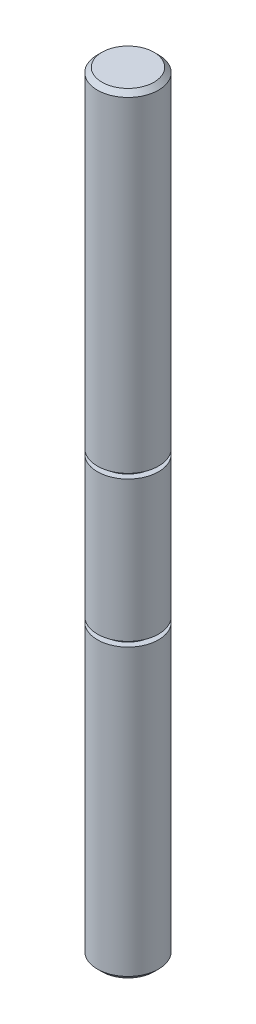
ISO-10303-21;
HEADER;
FILE_DESCRIPTION(('STEP AP214'),'2;1');
FILE_NAME('part.step','',(''),(''),'','','');
FILE_SCHEMA(('AUTOMOTIVE_DESIGN { 1 0 10303 214 1 1 1 1 }'));
ENDSEC;
DATA;
#1=APPLICATION_CONTEXT('core data for automotive mechanical design processes');
#2=APPLICATION_PROTOCOL_DEFINITION('international standard','automotive_design',2000,#1);
#3=PRODUCT_CONTEXT('',#1,'mechanical');
#4=PRODUCT('Part','Part','',(#3));
#5=PRODUCT_RELATED_PRODUCT_CATEGORY('part','',(#4));
#6=PRODUCT_DEFINITION_FORMATION('','',#4);
#7=PRODUCT_DEFINITION_CONTEXT('part definition',#1,'design');
#8=PRODUCT_DEFINITION('design','',#6,#7);
#9=PRODUCT_DEFINITION_SHAPE('','',#8);
#10=(LENGTH_UNIT() NAMED_UNIT(*) SI_UNIT(.MILLI.,.METRE.));
#11=(NAMED_UNIT(*) PLANE_ANGLE_UNIT() SI_UNIT($,.RADIAN.));
#12=(NAMED_UNIT(*) SI_UNIT($,.STERADIAN.) SOLID_ANGLE_UNIT());
#13=UNCERTAINTY_MEASURE_WITH_UNIT(LENGTH_MEASURE(1.E-05),#10,'distance_accuracy_value','');
#14=(GEOMETRIC_REPRESENTATION_CONTEXT(3) GLOBAL_UNCERTAINTY_ASSIGNED_CONTEXT((#13)) GLOBAL_UNIT_ASSIGNED_CONTEXT((#10,
#11,#12)) REPRESENTATION_CONTEXT('',''));
#15=CARTESIAN_POINT('',(0.,0.,0.));
#16=DIRECTION('',(0.,0.,1.));
#17=DIRECTION('',(1.,0.,0.));
#18=AXIS2_PLACEMENT_3D('',#15,#16,#17);
#19=CARTESIAN_POINT('',(0.,126.,0.));
#20=DIRECTION('',(0.,-1.,0.));
#21=DIRECTION('',(0.,0.,-1.));
#22=AXIS2_PLACEMENT_3D('',#19,#20,#21);
#23=CYLINDRICAL_SURFACE('',#22,5.);
#24=CARTESIAN_POINT('',(0.,47.4,0.));
#25=DIRECTION('',(0.,1.,0.));
#26=DIRECTION('',(0.,0.,1.));
#27=AXIS2_PLACEMENT_3D('',#24,#25,#26);
#28=CIRCLE('',#27,5.);
#29=CARTESIAN_POINT('',(0.,47.4,5.));
#30=VERTEX_POINT('',#29);
#31=EDGE_CURVE('E66',#30,#30,#28,.T.);
#32=ORIENTED_EDGE('',*,*,#31,.F.);
#33=EDGE_LOOP('',(#32));
#34=FACE_BOUND('',#33,.T.);
#35=CARTESIAN_POINT('',(0.,0.750000000000001,0.));
#36=DIRECTION('',(0.,1.,0.));
#37=DIRECTION('',(0.,0.,1.));
#38=AXIS2_PLACEMENT_3D('',#35,#36,#37);
#39=CIRCLE('',#38,5.);
#40=CARTESIAN_POINT('',(0.,0.750000000000001,5.));
#41=VERTEX_POINT('',#40);
#42=EDGE_CURVE('E50',#41,#41,#39,.T.);
#43=ORIENTED_EDGE('',*,*,#42,.T.);
#44=EDGE_LOOP('',(#43));
#45=FACE_BOUND('',#44,.T.);
#46=ADVANCED_FACE('F37',(#34,#45),#23,.T.);
#47=CARTESIAN_POINT('',(0.,0.,0.));
#48=DIRECTION('',(0.,1.,0.));
#49=DIRECTION('',(0.,0.,1.));
#50=AXIS2_PLACEMENT_3D('',#47,#48,#49);
#51=PLANE('',#50);
#52=CARTESIAN_POINT('',(0.,0.,0.));
#53=DIRECTION('',(0.,1.,0.));
#54=DIRECTION('',(0.,0.,1.));
#55=AXIS2_PLACEMENT_3D('',#52,#53,#54);
#56=CIRCLE('',#55,4.24999999999999);
#57=CARTESIAN_POINT('',(0.,0.,4.24999999999999));
#58=VERTEX_POINT('',#57);
#59=EDGE_CURVE('E10',#58,#58,#56,.F.);
#60=ORIENTED_EDGE('',*,*,#59,.T.);
#61=EDGE_LOOP('',(#60));
#62=FACE_BOUND('',#61,.T.);
#63=ADVANCED_FACE('F98',(#62),#51,.F.);
#64=CARTESIAN_POINT('',(0.,0.750000000000001,0.));
#65=DIRECTION('',(0.,1.,0.));
#66=DIRECTION('',(0.,0.,1.));
#67=AXIS2_PLACEMENT_3D('',#64,#65,#66);
#68=CONICAL_SURFACE('',#67,5.,0.785398163397455);
#69=ORIENTED_EDGE('',*,*,#59,.F.);
#70=EDGE_LOOP('',(#69));
#71=FACE_BOUND('',#70,.T.);
#72=ORIENTED_EDGE('',*,*,#42,.F.);
#73=EDGE_LOOP('',(#72));
#74=FACE_BOUND('',#73,.T.);
#75=ADVANCED_FACE('F39',(#71,#74),#68,.T.);
#76=CARTESIAN_POINT('',(-5.,48.2,0.));
#77=DIRECTION('',(0.,1.,0.));
#78=DIRECTION('',(0.,0.,1.));
#79=AXIS2_PLACEMENT_3D('',#76,#77,#78);
#80=PLANE('',#79);
#81=CARTESIAN_POINT('',(0.,48.2,0.));
#82=DIRECTION('',(0.,1.,0.));
#83=DIRECTION('',(0.,0.,1.));
#84=AXIS2_PLACEMENT_3D('',#81,#82,#83);
#85=CIRCLE('',#84,5.);
#86=CARTESIAN_POINT('',(0.,48.2,5.));
#87=VERTEX_POINT('',#86);
#88=EDGE_CURVE('E61',#87,#87,#85,.T.);
#89=ORIENTED_EDGE('',*,*,#88,.F.);
#90=EDGE_LOOP('',(#89));
#91=FACE_BOUND('',#90,.T.);
#92=CARTESIAN_POINT('',(0.,48.2,0.));
#93=DIRECTION('',(0.,1.,0.));
#94=DIRECTION('',(0.,0.,1.));
#95=AXIS2_PLACEMENT_3D('',#92,#93,#94);
#96=CIRCLE('',#95,4.);
#97=CARTESIAN_POINT('',(0.,48.2,4.));
#98=VERTEX_POINT('',#97);
#99=EDGE_CURVE('E82',#98,#98,#96,.T.);
#100=ORIENTED_EDGE('',*,*,#99,.T.);
#101=EDGE_LOOP('',(#100));
#102=FACE_BOUND('',#101,.T.);
#103=ADVANCED_FACE('F105',(#91,#102),#80,.F.);
#104=CARTESIAN_POINT('',(0.,111.50643276967,0.));
#105=DIRECTION('',(0.,1.,0.));
#106=DIRECTION('',(0.,0.,1.));
#107=AXIS2_PLACEMENT_3D('',#104,#105,#106);
#108=CYLINDRICAL_SURFACE('',#107,4.);
#109=ORIENTED_EDGE('',*,*,#99,.F.);
#110=EDGE_LOOP('',(#109));
#111=FACE_BOUND('',#110,.T.);
#112=CARTESIAN_POINT('',(0.,47.4,0.));
#113=DIRECTION('',(0.,1.,0.));
#114=DIRECTION('',(0.,0.,1.));
#115=AXIS2_PLACEMENT_3D('',#112,#113,#114);
#116=CIRCLE('',#115,4.);
#117=CARTESIAN_POINT('',(0.,47.4,4.));
#118=VERTEX_POINT('',#117);
#119=EDGE_CURVE('E86',#118,#118,#116,.T.);
#120=ORIENTED_EDGE('',*,*,#119,.T.);
#121=EDGE_LOOP('',(#120));
#122=FACE_BOUND('',#121,.T.);
#123=ADVANCED_FACE('F111',(#111,#122),#108,.T.);
#124=CARTESIAN_POINT('',(-5.,47.4,0.));
#125=DIRECTION('',(0.,-1.,0.));
#126=DIRECTION('',(0.,0.,-1.));
#127=AXIS2_PLACEMENT_3D('',#124,#125,#126);
#128=PLANE('',#127);
#129=ORIENTED_EDGE('',*,*,#119,.F.);
#130=EDGE_LOOP('',(#129));
#131=FACE_BOUND('',#130,.T.);
#132=ORIENTED_EDGE('',*,*,#31,.T.);
#133=EDGE_LOOP('',(#132));
#134=FACE_BOUND('',#133,.T.);
#135=ADVANCED_FACE('F94',(#131,#134),#128,.F.);
#136=ORIENTED_EDGE('',*,*,#88,.T.);
#137=EDGE_LOOP('',(#136));
#138=FACE_BOUND('',#137,.T.);
#139=CARTESIAN_POINT('',(0.,71.2,0.));
#140=DIRECTION('',(0.,1.,0.));
#141=DIRECTION('',(0.,0.,1.));
#142=AXIS2_PLACEMENT_3D('',#139,#140,#141);
#143=CIRCLE('',#142,5.00000000000008);
#144=CARTESIAN_POINT('',(0.,71.2,5.00000000000008));
#145=VERTEX_POINT('',#144);
#146=EDGE_CURVE('E75',#145,#145,#143,.T.);
#147=ORIENTED_EDGE('',*,*,#146,.F.);
#148=EDGE_LOOP('',(#147));
#149=FACE_BOUND('',#148,.T.);
#150=ADVANCED_FACE('F101',(#138,#149),#23,.T.);
#151=CARTESIAN_POINT('',(-5.00000000000008,71.2,0.));
#152=DIRECTION('',(0.,-1.,0.));
#153=DIRECTION('',(0.,0.,-1.));
#154=AXIS2_PLACEMENT_3D('',#151,#152,#153);
#155=PLANE('',#154);
#156=CARTESIAN_POINT('',(0.,71.2,0.));
#157=DIRECTION('',(0.,1.,0.));
#158=DIRECTION('',(0.,0.,1.));
#159=AXIS2_PLACEMENT_3D('',#156,#157,#158);
#160=CIRCLE('',#159,4.00000000000008);
#161=CARTESIAN_POINT('',(0.,71.2,4.00000000000008));
#162=VERTEX_POINT('',#161);
#163=EDGE_CURVE('E62',#162,#162,#160,.T.);
#164=ORIENTED_EDGE('',*,*,#163,.F.);
#165=EDGE_LOOP('',(#164));
#166=FACE_BOUND('',#165,.T.);
#167=ORIENTED_EDGE('',*,*,#146,.T.);
#168=EDGE_LOOP('',(#167));
#169=FACE_BOUND('',#168,.T.);
#170=ADVANCED_FACE('F141',(#166,#169),#155,.F.);
#171=CARTESIAN_POINT('',(0.,111.50643276967,0.));
#172=DIRECTION('',(0.,1.,0.));
#173=DIRECTION('',(0.,0.,1.));
#174=AXIS2_PLACEMENT_3D('',#171,#172,#173);
#175=CYLINDRICAL_SURFACE('',#174,4.00000000000008);
#176=CARTESIAN_POINT('',(0.,72.,0.));
#177=DIRECTION('',(0.,1.,0.));
#178=DIRECTION('',(0.,0.,1.));
#179=AXIS2_PLACEMENT_3D('',#176,#177,#178);
#180=CIRCLE('',#179,4.00000000000008);
#181=CARTESIAN_POINT('',(0.,72.,4.00000000000008));
#182=VERTEX_POINT('',#181);
#183=EDGE_CURVE('E67',#182,#182,#180,.T.);
#184=ORIENTED_EDGE('',*,*,#183,.F.);
#185=EDGE_LOOP('',(#184));
#186=FACE_BOUND('',#185,.T.);
#187=ORIENTED_EDGE('',*,*,#163,.T.);
#188=EDGE_LOOP('',(#187));
#189=FACE_BOUND('',#188,.T.);
#190=ADVANCED_FACE('F135',(#186,#189),#175,.T.);
#191=CARTESIAN_POINT('',(-5.,72.,0.));
#192=DIRECTION('',(0.,1.,0.));
#193=DIRECTION('',(0.,0.,1.));
#194=AXIS2_PLACEMENT_3D('',#191,#192,#193);
#195=PLANE('',#194);
#196=CARTESIAN_POINT('',(0.,72.,0.));
#197=DIRECTION('',(0.,1.,0.));
#198=DIRECTION('',(0.,0.,1.));
#199=AXIS2_PLACEMENT_3D('',#196,#197,#198);
#200=CIRCLE('',#199,5.);
#201=CARTESIAN_POINT('',(0.,72.,5.));
#202=VERTEX_POINT('',#201);
#203=EDGE_CURVE('E71',#202,#202,#200,.T.);
#204=ORIENTED_EDGE('',*,*,#203,.F.);
#205=EDGE_LOOP('',(#204));
#206=FACE_BOUND('',#205,.T.);
#207=ORIENTED_EDGE('',*,*,#183,.T.);
#208=EDGE_LOOP('',(#207));
#209=FACE_BOUND('',#208,.T.);
#210=ADVANCED_FACE('F128',(#206,#209),#195,.F.);
#211=CARTESIAN_POINT('',(0.,126.,0.));
#212=DIRECTION('',(0.,1.,0.));
#213=DIRECTION('',(0.,0.,1.));
#214=AXIS2_PLACEMENT_3D('',#211,#212,#213);
#215=PLANE('',#214);
#216=CARTESIAN_POINT('',(0.,126.,0.));
#217=DIRECTION('',(0.,1.,0.));
#218=DIRECTION('',(0.,0.,1.));
#219=AXIS2_PLACEMENT_3D('',#216,#217,#218);
#220=CIRCLE('',#219,4.25);
#221=CARTESIAN_POINT('',(0.,126.,4.25));
#222=VERTEX_POINT('',#221);
#223=EDGE_CURVE('E55',#222,#222,#220,.T.);
#224=ORIENTED_EDGE('',*,*,#223,.T.);
#225=EDGE_LOOP('',(#224));
#226=FACE_BOUND('',#225,.T.);
#227=ADVANCED_FACE('F118',(#226),#215,.T.);
#228=CARTESIAN_POINT('',(0.,126.,0.));
#229=DIRECTION('',(0.,-1.,0.));
#230=DIRECTION('',(0.,0.,-1.));
#231=AXIS2_PLACEMENT_3D('',#228,#229,#230);
#232=CONICAL_SURFACE('',#231,4.25,0.785398163397464);
#233=CARTESIAN_POINT('',(0.,125.25,0.));
#234=DIRECTION('',(0.,1.,0.));
#235=DIRECTION('',(0.,0.,1.));
#236=AXIS2_PLACEMENT_3D('',#233,#234,#235);
#237=CIRCLE('',#236,5.);
#238=CARTESIAN_POINT('',(0.,125.25,5.));
#239=VERTEX_POINT('',#238);
#240=EDGE_CURVE('E45',#239,#239,#237,.F.);
#241=ORIENTED_EDGE('',*,*,#240,.F.);
#242=EDGE_LOOP('',(#241));
#243=FACE_BOUND('',#242,.T.);
#244=ORIENTED_EDGE('',*,*,#223,.F.);
#245=EDGE_LOOP('',(#244));
#246=FACE_BOUND('',#245,.T.);
#247=ADVANCED_FACE('F121',(#243,#246),#232,.T.);
#248=ORIENTED_EDGE('',*,*,#203,.T.);
#249=EDGE_LOOP('',(#248));
#250=FACE_BOUND('',#249,.T.);
#251=ORIENTED_EDGE('',*,*,#240,.T.);
#252=EDGE_LOOP('',(#251));
#253=FACE_BOUND('',#252,.T.);
#254=ADVANCED_FACE('F100',(#250,#253),#23,.T.);
#255=CLOSED_SHELL('',(#46,#63,#75,#103,#123,#135,#150,#170,#190,#210,#227,#247,#254));
#256=MANIFOLD_SOLID_BREP('B2',#255);
#257=ADVANCED_BREP_SHAPE_REPRESENTATION('',(#18,#256),#14);
#258=SHAPE_DEFINITION_REPRESENTATION(#9,#257);
ENDSEC;
END-ISO-10303-21;
